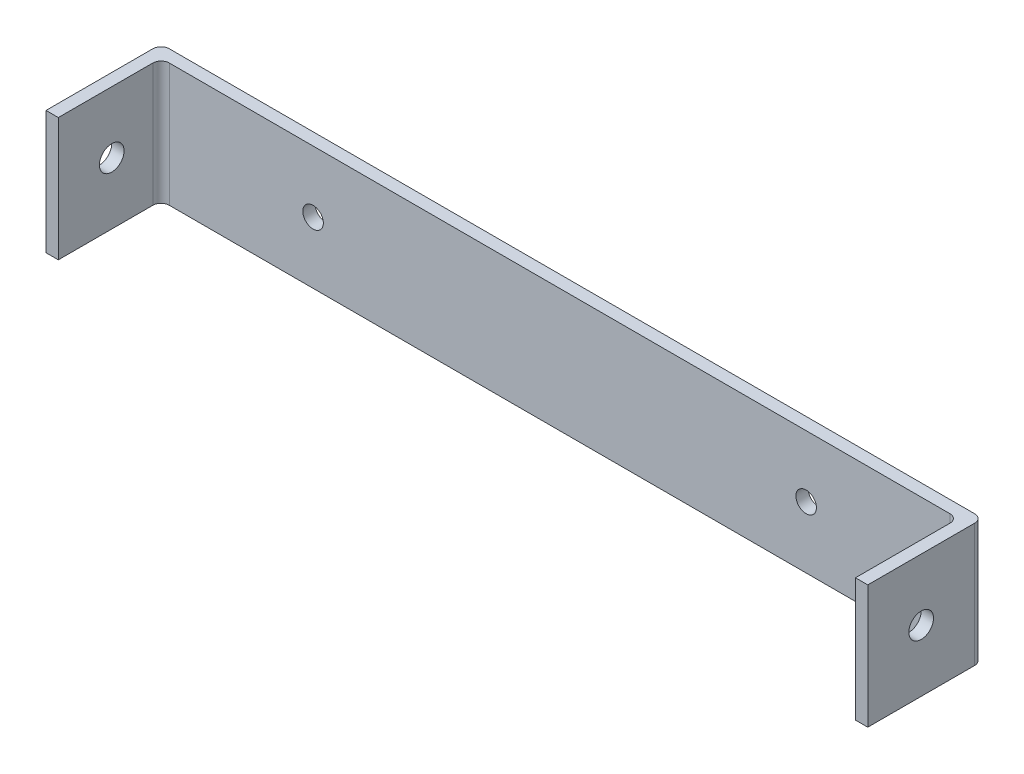
ISO-10303-21;
HEADER;
FILE_DESCRIPTION(('STEP AP214'),'2;1');
FILE_NAME('part.step','',(''),(''),'','','');
FILE_SCHEMA(('AUTOMOTIVE_DESIGN { 1 0 10303 214 1 1 1 1 }'));
ENDSEC;
DATA;
#1=APPLICATION_CONTEXT('core data for automotive mechanical design processes');
#2=APPLICATION_PROTOCOL_DEFINITION('international standard','automotive_design',2000,#1);
#3=PRODUCT_CONTEXT('',#1,'mechanical');
#4=PRODUCT('Part','Part','',(#3));
#5=PRODUCT_RELATED_PRODUCT_CATEGORY('part','',(#4));
#6=PRODUCT_DEFINITION_FORMATION('','',#4);
#7=PRODUCT_DEFINITION_CONTEXT('part definition',#1,'design');
#8=PRODUCT_DEFINITION('design','',#6,#7);
#9=PRODUCT_DEFINITION_SHAPE('','',#8);
#10=(LENGTH_UNIT() NAMED_UNIT(*) SI_UNIT(.MILLI.,.METRE.));
#11=(NAMED_UNIT(*) PLANE_ANGLE_UNIT() SI_UNIT($,.RADIAN.));
#12=(NAMED_UNIT(*) SI_UNIT($,.STERADIAN.) SOLID_ANGLE_UNIT());
#13=UNCERTAINTY_MEASURE_WITH_UNIT(LENGTH_MEASURE(1.E-05),#10,'distance_accuracy_value','');
#14=(GEOMETRIC_REPRESENTATION_CONTEXT(3) GLOBAL_UNCERTAINTY_ASSIGNED_CONTEXT((#13)) GLOBAL_UNIT_ASSIGNED_CONTEXT((#10,
#11,#12)) REPRESENTATION_CONTEXT('',''));
#15=CARTESIAN_POINT('',(0.,0.,0.));
#16=DIRECTION('',(0.,0.,1.));
#17=DIRECTION('',(1.,0.,0.));
#18=AXIS2_PLACEMENT_3D('',#15,#16,#17);
#19=CARTESIAN_POINT('',(0.,0.,3.));
#20=DIRECTION('',(0.,0.,1.));
#21=DIRECTION('',(1.,0.,0.));
#22=AXIS2_PLACEMENT_3D('',#19,#20,#21);
#23=PLANE('',#22);
#24=CARTESIAN_POINT('',(40.,-15.,3.));
#25=DIRECTION('',(0.,0.,1.));
#26=DIRECTION('',(1.,0.,0.));
#27=AXIS2_PLACEMENT_3D('',#24,#25,#26);
#28=CIRCLE('',#27,2.5);
#29=CARTESIAN_POINT('',(42.5,-15.,3.));
#30=VERTEX_POINT('',#29);
#31=EDGE_CURVE('E184',#30,#30,#28,.T.);
#32=ORIENTED_EDGE('',*,*,#31,.F.);
#33=EDGE_LOOP('',(#32));
#34=FACE_BOUND('',#33,.T.);
#35=CARTESIAN_POINT('',(160.,-15.,3.));
#36=DIRECTION('',(0.,0.,1.));
#37=DIRECTION('',(1.,0.,0.));
#38=AXIS2_PLACEMENT_3D('',#35,#36,#37);
#39=CIRCLE('',#38,2.5);
#40=CARTESIAN_POINT('',(162.5,-15.,3.));
#41=VERTEX_POINT('',#40);
#42=EDGE_CURVE('E178',#41,#41,#39,.T.);
#43=ORIENTED_EDGE('',*,*,#42,.F.);
#44=EDGE_LOOP('',(#43));
#45=FACE_BOUND('',#44,.T.);
#46=DIRECTION('',(1.,0.,0.));
#47=VECTOR('',#46,1.);
#48=CARTESIAN_POINT('',(0.,-30.,3.));
#49=LINE('',#48,#47);
#50=CARTESIAN_POINT('',(5.,-30.,3.));
#51=VERTEX_POINT('',#50);
#52=CARTESIAN_POINT('',(195.,-30.,3.));
#53=VERTEX_POINT('',#52);
#54=EDGE_CURVE('E190',#51,#53,#49,.T.);
#55=ORIENTED_EDGE('',*,*,#54,.T.);
#56=DIRECTION('',(0.,-1.,0.));
#57=VECTOR('',#56,1.);
#58=CARTESIAN_POINT('',(195.,0.,3.));
#59=LINE('',#58,#57);
#60=CARTESIAN_POINT('',(195.,0.,3.));
#61=VERTEX_POINT('',#60);
#62=EDGE_CURVE('E228',#53,#61,#59,.F.);
#63=ORIENTED_EDGE('',*,*,#62,.T.);
#64=DIRECTION('',(-1.,0.,0.));
#65=VECTOR('',#64,1.);
#66=CARTESIAN_POINT('',(0.,0.,3.));
#67=LINE('',#66,#65);
#68=CARTESIAN_POINT('',(5.,0.,3.));
#69=VERTEX_POINT('',#68);
#70=EDGE_CURVE('E193',#61,#69,#67,.T.);
#71=ORIENTED_EDGE('',*,*,#70,.T.);
#72=DIRECTION('',(0.,1.,0.));
#73=VECTOR('',#72,1.);
#74=CARTESIAN_POINT('',(5.,0.,3.));
#75=LINE('',#74,#73);
#76=EDGE_CURVE('E226',#69,#51,#75,.F.);
#77=ORIENTED_EDGE('',*,*,#76,.T.);
#78=EDGE_LOOP('',(#55,#63,#71,#77));
#79=FACE_BOUND('',#78,.T.);
#80=ADVANCED_FACE('F33',(#34,#45,#79),#23,.T.);
#81=CARTESIAN_POINT('',(0.,0.,0.));
#82=DIRECTION('',(0.,0.,1.));
#83=DIRECTION('',(1.,0.,0.));
#84=AXIS2_PLACEMENT_3D('',#81,#82,#83);
#85=PLANE('',#84);
#86=DIRECTION('',(-1.,0.,0.));
#87=VECTOR('',#86,1.);
#88=CARTESIAN_POINT('',(0.,0.,0.));
#89=LINE('',#88,#87);
#90=CARTESIAN_POINT('',(198.,0.,0.));
#91=VERTEX_POINT('',#90);
#92=CARTESIAN_POINT('',(2.,0.,0.));
#93=VERTEX_POINT('',#92);
#94=EDGE_CURVE('E194',#91,#93,#89,.T.);
#95=ORIENTED_EDGE('',*,*,#94,.F.);
#96=DIRECTION('',(0.,1.,0.));
#97=VECTOR('',#96,1.);
#98=CARTESIAN_POINT('',(198.,0.,0.));
#99=LINE('',#98,#97);
#100=CARTESIAN_POINT('',(198.,-30.,0.));
#101=VERTEX_POINT('',#100);
#102=EDGE_CURVE('E218',#91,#101,#99,.F.);
#103=ORIENTED_EDGE('',*,*,#102,.T.);
#104=DIRECTION('',(1.,0.,0.));
#105=VECTOR('',#104,1.);
#106=CARTESIAN_POINT('',(0.,-30.,0.));
#107=LINE('',#106,#105);
#108=CARTESIAN_POINT('',(2.,-30.,0.));
#109=VERTEX_POINT('',#108);
#110=EDGE_CURVE('E187',#109,#101,#107,.T.);
#111=ORIENTED_EDGE('',*,*,#110,.F.);
#112=DIRECTION('',(0.,-1.,0.));
#113=VECTOR('',#112,1.);
#114=CARTESIAN_POINT('',(2.,0.,0.));
#115=LINE('',#114,#113);
#116=EDGE_CURVE('E216',#109,#93,#115,.F.);
#117=ORIENTED_EDGE('',*,*,#116,.T.);
#118=EDGE_LOOP('',(#95,#103,#111,#117));
#119=FACE_BOUND('',#118,.T.);
#120=CARTESIAN_POINT('',(40.,-15.,0.));
#121=DIRECTION('',(0.,0.,1.));
#122=DIRECTION('',(1.,0.,0.));
#123=AXIS2_PLACEMENT_3D('',#120,#121,#122);
#124=CIRCLE('',#123,2.5);
#125=CARTESIAN_POINT('',(42.5,-15.,0.));
#126=VERTEX_POINT('',#125);
#127=EDGE_CURVE('E181',#126,#126,#124,.T.);
#128=ORIENTED_EDGE('',*,*,#127,.T.);
#129=EDGE_LOOP('',(#128));
#130=FACE_BOUND('',#129,.T.);
#131=CARTESIAN_POINT('',(160.,-15.,0.));
#132=DIRECTION('',(0.,0.,1.));
#133=DIRECTION('',(1.,0.,0.));
#134=AXIS2_PLACEMENT_3D('',#131,#132,#133);
#135=CIRCLE('',#134,2.5);
#136=CARTESIAN_POINT('',(162.5,-15.,0.));
#137=VERTEX_POINT('',#136);
#138=EDGE_CURVE('E177',#137,#137,#135,.T.);
#139=ORIENTED_EDGE('',*,*,#138,.T.);
#140=EDGE_LOOP('',(#139));
#141=FACE_BOUND('',#140,.T.);
#142=ADVANCED_FACE('F262',(#119,#130,#141),#85,.F.);
#143=CARTESIAN_POINT('',(0.,0.,3.));
#144=DIRECTION('',(1.,0.,0.));
#145=DIRECTION('',(0.,0.,-1.));
#146=AXIS2_PLACEMENT_3D('',#143,#144,#145);
#147=PLANE('',#146);
#148=CARTESIAN_POINT('',(0.,-15.,15.));
#149=DIRECTION('',(-1.,0.,0.));
#150=DIRECTION('',(0.,0.,1.));
#151=AXIS2_PLACEMENT_3D('',#148,#149,#150);
#152=CIRCLE('',#151,3.);
#153=CARTESIAN_POINT('',(0.,-15.,18.));
#154=VERTEX_POINT('',#153);
#155=EDGE_CURVE('E210',#154,#154,#152,.T.);
#156=ORIENTED_EDGE('',*,*,#155,.F.);
#157=EDGE_LOOP('',(#156));
#158=FACE_BOUND('',#157,.T.);
#159=DIRECTION('',(0.,0.,-1.));
#160=VECTOR('',#159,1.);
#161=CARTESIAN_POINT('',(0.,0.,3.));
#162=LINE('',#161,#160);
#163=CARTESIAN_POINT('',(0.,0.,28.));
#164=VERTEX_POINT('',#163);
#165=CARTESIAN_POINT('',(0.,0.,2.));
#166=VERTEX_POINT('',#165);
#167=EDGE_CURVE('E134',#164,#166,#162,.T.);
#168=ORIENTED_EDGE('',*,*,#167,.T.);
#169=DIRECTION('',(0.,-1.,0.));
#170=VECTOR('',#169,1.);
#171=CARTESIAN_POINT('',(0.,0.,2.));
#172=LINE('',#171,#170);
#173=CARTESIAN_POINT('',(0.,-30.,2.));
#174=VERTEX_POINT('',#173);
#175=EDGE_CURVE('E230',#166,#174,#172,.T.);
#176=ORIENTED_EDGE('',*,*,#175,.T.);
#177=DIRECTION('',(0.,0.,-1.));
#178=VECTOR('',#177,1.);
#179=CARTESIAN_POINT('',(0.,-30.,3.));
#180=LINE('',#179,#178);
#181=CARTESIAN_POINT('',(0.,-30.,28.));
#182=VERTEX_POINT('',#181);
#183=EDGE_CURVE('E204',#182,#174,#180,.T.);
#184=ORIENTED_EDGE('',*,*,#183,.F.);
#185=DIRECTION('',(0.,-1.,0.));
#186=VECTOR('',#185,1.);
#187=CARTESIAN_POINT('',(0.,-30.,28.));
#188=LINE('',#187,#186);
#189=EDGE_CURVE('E162',#164,#182,#188,.T.);
#190=ORIENTED_EDGE('',*,*,#189,.F.);
#191=EDGE_LOOP('',(#168,#176,#184,#190));
#192=FACE_BOUND('',#191,.T.);
#193=ADVANCED_FACE('F256',(#158,#192),#147,.F.);
#194=CARTESIAN_POINT('',(0.,-30.,3.));
#195=DIRECTION('',(0.,1.,0.));
#196=DIRECTION('',(0.,0.,1.));
#197=AXIS2_PLACEMENT_3D('',#194,#195,#196);
#198=PLANE('',#197);
#199=ORIENTED_EDGE('',*,*,#110,.T.);
#200=CARTESIAN_POINT('',(198.,-30.,2.));
#201=DIRECTION('',(0.,1.,0.));
#202=DIRECTION('',(0.,0.,1.));
#203=AXIS2_PLACEMENT_3D('',#200,#201,#202);
#204=CIRCLE('',#203,2.);
#205=CARTESIAN_POINT('',(200.,-30.,2.));
#206=VERTEX_POINT('',#205);
#207=EDGE_CURVE('E221',#101,#206,#204,.F.);
#208=ORIENTED_EDGE('',*,*,#207,.T.);
#209=DIRECTION('',(0.,0.,-1.));
#210=VECTOR('',#209,1.);
#211=CARTESIAN_POINT('',(200.,-30.,3.));
#212=LINE('',#211,#210);
#213=CARTESIAN_POINT('',(200.,-30.,28.));
#214=VERTEX_POINT('',#213);
#215=EDGE_CURVE('E133',#214,#206,#212,.T.);
#216=ORIENTED_EDGE('',*,*,#215,.F.);
#217=DIRECTION('',(1.,0.,0.));
#218=VECTOR('',#217,1.);
#219=CARTESIAN_POINT('',(200.,-30.,28.));
#220=LINE('',#219,#218);
#221=CARTESIAN_POINT('',(197.,-30.,28.));
#222=VERTEX_POINT('',#221);
#223=EDGE_CURVE('E148',#222,#214,#220,.T.);
#224=ORIENTED_EDGE('',*,*,#223,.F.);
#225=DIRECTION('',(0.,0.,-1.));
#226=VECTOR('',#225,1.);
#227=CARTESIAN_POINT('',(197.,-30.,28.));
#228=LINE('',#227,#226);
#229=CARTESIAN_POINT('',(197.,-30.,5.));
#230=VERTEX_POINT('',#229);
#231=EDGE_CURVE('E158',#222,#230,#228,.T.);
#232=ORIENTED_EDGE('',*,*,#231,.T.);
#233=CARTESIAN_POINT('',(195.,-30.,5.));
#234=DIRECTION('',(0.,1.,0.));
#235=DIRECTION('',(0.,0.,1.));
#236=AXIS2_PLACEMENT_3D('',#233,#234,#235);
#237=CIRCLE('',#236,2.);
#238=EDGE_CURVE('E235',#230,#53,#237,.T.);
#239=ORIENTED_EDGE('',*,*,#238,.T.);
#240=ORIENTED_EDGE('',*,*,#54,.F.);
#241=CARTESIAN_POINT('',(5.,-30.,5.));
#242=DIRECTION('',(0.,1.,0.));
#243=DIRECTION('',(0.,0.,1.));
#244=AXIS2_PLACEMENT_3D('',#241,#242,#243);
#245=CIRCLE('',#244,2.);
#246=CARTESIAN_POINT('',(3.,-30.,5.));
#247=VERTEX_POINT('',#246);
#248=EDGE_CURVE('E11',#51,#247,#245,.T.);
#249=ORIENTED_EDGE('',*,*,#248,.T.);
#250=DIRECTION('',(0.,0.,-1.));
#251=VECTOR('',#250,1.);
#252=CARTESIAN_POINT('',(3.,-30.,28.));
#253=LINE('',#252,#251);
#254=CARTESIAN_POINT('',(3.,-30.,28.));
#255=VERTEX_POINT('',#254);
#256=EDGE_CURVE('E175',#255,#247,#253,.T.);
#257=ORIENTED_EDGE('',*,*,#256,.F.);
#258=DIRECTION('',(1.,0.,0.));
#259=VECTOR('',#258,1.);
#260=CARTESIAN_POINT('',(0.,-30.,28.));
#261=LINE('',#260,#259);
#262=EDGE_CURVE('E165',#182,#255,#261,.T.);
#263=ORIENTED_EDGE('',*,*,#262,.F.);
#264=ORIENTED_EDGE('',*,*,#183,.T.);
#265=CARTESIAN_POINT('',(2.,-30.,2.));
#266=DIRECTION('',(0.,1.,0.));
#267=DIRECTION('',(0.,0.,1.));
#268=AXIS2_PLACEMENT_3D('',#265,#266,#267);
#269=CIRCLE('',#268,2.);
#270=EDGE_CURVE('E48',#174,#109,#269,.F.);
#271=ORIENTED_EDGE('',*,*,#270,.T.);
#272=EDGE_LOOP('',(#199,#208,#216,#224,#232,#239,#240,#249,#257,#263,#264,#271));
#273=FACE_BOUND('',#272,.T.);
#274=ADVANCED_FACE('F251',(#273),#198,.F.);
#275=CARTESIAN_POINT('',(200.,0.,3.));
#276=DIRECTION('',(-1.,0.,0.));
#277=DIRECTION('',(0.,0.,1.));
#278=AXIS2_PLACEMENT_3D('',#275,#276,#277);
#279=PLANE('',#278);
#280=CARTESIAN_POINT('',(200.,-15.,15.));
#281=DIRECTION('',(-1.,0.,0.));
#282=DIRECTION('',(0.,0.,1.));
#283=AXIS2_PLACEMENT_3D('',#280,#281,#282);
#284=CIRCLE('',#283,3.);
#285=CARTESIAN_POINT('',(200.,-15.,18.));
#286=VERTEX_POINT('',#285);
#287=EDGE_CURVE('E149',#286,#286,#284,.T.);
#288=ORIENTED_EDGE('',*,*,#287,.T.);
#289=EDGE_LOOP('',(#288));
#290=FACE_BOUND('',#289,.T.);
#291=ORIENTED_EDGE('',*,*,#215,.T.);
#292=DIRECTION('',(0.,1.,0.));
#293=VECTOR('',#292,1.);
#294=CARTESIAN_POINT('',(200.,0.,2.));
#295=LINE('',#294,#293);
#296=CARTESIAN_POINT('',(200.,0.,2.));
#297=VERTEX_POINT('',#296);
#298=EDGE_CURVE('E131',#206,#297,#295,.T.);
#299=ORIENTED_EDGE('',*,*,#298,.T.);
#300=DIRECTION('',(0.,0.,-1.));
#301=VECTOR('',#300,1.);
#302=CARTESIAN_POINT('',(200.,0.,3.));
#303=LINE('',#302,#301);
#304=CARTESIAN_POINT('',(200.,0.,28.));
#305=VERTEX_POINT('',#304);
#306=EDGE_CURVE('E124',#305,#297,#303,.T.);
#307=ORIENTED_EDGE('',*,*,#306,.F.);
#308=DIRECTION('',(0.,1.,0.));
#309=VECTOR('',#308,1.);
#310=CARTESIAN_POINT('',(200.,0.,28.));
#311=LINE('',#310,#309);
#312=EDGE_CURVE('E129',#214,#305,#311,.T.);
#313=ORIENTED_EDGE('',*,*,#312,.F.);
#314=EDGE_LOOP('',(#291,#299,#307,#313));
#315=FACE_BOUND('',#314,.T.);
#316=ADVANCED_FACE('F127',(#290,#315),#279,.F.);
#317=CARTESIAN_POINT('',(0.,0.,3.));
#318=DIRECTION('',(0.,-1.,0.));
#319=DIRECTION('',(0.,0.,-1.));
#320=AXIS2_PLACEMENT_3D('',#317,#318,#319);
#321=PLANE('',#320);
#322=ORIENTED_EDGE('',*,*,#306,.T.);
#323=CARTESIAN_POINT('',(198.,0.,2.));
#324=DIRECTION('',(0.,-1.,0.));
#325=DIRECTION('',(0.,0.,-1.));
#326=AXIS2_PLACEMENT_3D('',#323,#324,#325);
#327=CIRCLE('',#326,2.);
#328=EDGE_CURVE('E214',#297,#91,#327,.F.);
#329=ORIENTED_EDGE('',*,*,#328,.T.);
#330=ORIENTED_EDGE('',*,*,#94,.T.);
#331=CARTESIAN_POINT('',(2.,0.,2.));
#332=DIRECTION('',(0.,-1.,0.));
#333=DIRECTION('',(0.,0.,-1.));
#334=AXIS2_PLACEMENT_3D('',#331,#332,#333);
#335=CIRCLE('',#334,2.);
#336=EDGE_CURVE('E212',#93,#166,#335,.F.);
#337=ORIENTED_EDGE('',*,*,#336,.T.);
#338=ORIENTED_EDGE('',*,*,#167,.F.);
#339=DIRECTION('',(-1.,0.,0.));
#340=VECTOR('',#339,1.);
#341=CARTESIAN_POINT('',(0.,0.,28.));
#342=LINE('',#341,#340);
#343=CARTESIAN_POINT('',(3.,0.,28.));
#344=VERTEX_POINT('',#343);
#345=EDGE_CURVE('E169',#344,#164,#342,.T.);
#346=ORIENTED_EDGE('',*,*,#345,.F.);
#347=DIRECTION('',(0.,0.,-1.));
#348=VECTOR('',#347,1.);
#349=CARTESIAN_POINT('',(3.,0.,28.));
#350=LINE('',#349,#348);
#351=CARTESIAN_POINT('',(3.,0.,5.));
#352=VERTEX_POINT('',#351);
#353=EDGE_CURVE('E172',#344,#352,#350,.T.);
#354=ORIENTED_EDGE('',*,*,#353,.T.);
#355=CARTESIAN_POINT('',(5.,0.,5.));
#356=DIRECTION('',(0.,-1.,0.));
#357=DIRECTION('',(0.,0.,-1.));
#358=AXIS2_PLACEMENT_3D('',#355,#356,#357);
#359=CIRCLE('',#358,2.);
#360=EDGE_CURVE('E41',#352,#69,#359,.T.);
#361=ORIENTED_EDGE('',*,*,#360,.T.);
#362=ORIENTED_EDGE('',*,*,#70,.F.);
#363=CARTESIAN_POINT('',(195.,0.,5.));
#364=DIRECTION('',(0.,-1.,0.));
#365=DIRECTION('',(0.,0.,-1.));
#366=AXIS2_PLACEMENT_3D('',#363,#364,#365);
#367=CIRCLE('',#366,2.);
#368=CARTESIAN_POINT('',(197.,0.,5.));
#369=VERTEX_POINT('',#368);
#370=EDGE_CURVE('E237',#61,#369,#367,.T.);
#371=ORIENTED_EDGE('',*,*,#370,.T.);
#372=DIRECTION('',(0.,0.,-1.));
#373=VECTOR('',#372,1.);
#374=CARTESIAN_POINT('',(197.,0.,28.));
#375=LINE('',#374,#373);
#376=CARTESIAN_POINT('',(197.,0.,28.));
#377=VERTEX_POINT('',#376);
#378=EDGE_CURVE('E140',#377,#369,#375,.T.);
#379=ORIENTED_EDGE('',*,*,#378,.F.);
#380=DIRECTION('',(-1.,0.,0.));
#381=VECTOR('',#380,1.);
#382=CARTESIAN_POINT('',(200.,0.,28.));
#383=LINE('',#382,#381);
#384=EDGE_CURVE('E137',#305,#377,#383,.T.);
#385=ORIENTED_EDGE('',*,*,#384,.F.);
#386=EDGE_LOOP('',(#322,#329,#330,#337,#338,#346,#354,#361,#362,#371,#379,#385));
#387=FACE_BOUND('',#386,.T.);
#388=ADVANCED_FACE('F138',(#387),#321,.F.);
#389=CARTESIAN_POINT('',(40.,-15.,3.));
#390=DIRECTION('',(0.,0.,-1.));
#391=DIRECTION('',(-1.,0.,0.));
#392=AXIS2_PLACEMENT_3D('',#389,#390,#391);
#393=CYLINDRICAL_SURFACE('',#392,2.5);
#394=ORIENTED_EDGE('',*,*,#31,.T.);
#395=EDGE_LOOP('',(#394));
#396=FACE_BOUND('',#395,.T.);
#397=ORIENTED_EDGE('',*,*,#127,.F.);
#398=EDGE_LOOP('',(#397));
#399=FACE_BOUND('',#398,.T.);
#400=ADVANCED_FACE('F292',(#396,#399),#393,.F.);
#401=CARTESIAN_POINT('',(160.,-15.,3.));
#402=DIRECTION('',(0.,0.,-1.));
#403=DIRECTION('',(-1.,0.,0.));
#404=AXIS2_PLACEMENT_3D('',#401,#402,#403);
#405=CYLINDRICAL_SURFACE('',#404,2.5);
#406=ORIENTED_EDGE('',*,*,#42,.T.);
#407=EDGE_LOOP('',(#406));
#408=FACE_BOUND('',#407,.T.);
#409=ORIENTED_EDGE('',*,*,#138,.F.);
#410=EDGE_LOOP('',(#409));
#411=FACE_BOUND('',#410,.T.);
#412=ADVANCED_FACE('F330',(#408,#411),#405,.F.);
#413=CARTESIAN_POINT('',(3.,-30.,28.));
#414=DIRECTION('',(-1.,0.,0.));
#415=DIRECTION('',(0.,-1.,0.));
#416=AXIS2_PLACEMENT_3D('',#413,#414,#415);
#417=PLANE('',#416);
#418=CARTESIAN_POINT('',(3.,-15.,15.));
#419=DIRECTION('',(-1.,0.,0.));
#420=DIRECTION('',(0.,-1.,0.));
#421=AXIS2_PLACEMENT_3D('',#418,#419,#420);
#422=CIRCLE('',#421,3.);
#423=CARTESIAN_POINT('',(3.,-18.,15.));
#424=VERTEX_POINT('',#423);
#425=EDGE_CURVE('E152',#424,#424,#422,.T.);
#426=ORIENTED_EDGE('',*,*,#425,.T.);
#427=EDGE_LOOP('',(#426));
#428=FACE_BOUND('',#427,.T.);
#429=ORIENTED_EDGE('',*,*,#256,.T.);
#430=DIRECTION('',(0.,1.,0.));
#431=VECTOR('',#430,1.);
#432=CARTESIAN_POINT('',(3.,-30.,5.));
#433=LINE('',#432,#431);
#434=EDGE_CURVE('E232',#247,#352,#433,.T.);
#435=ORIENTED_EDGE('',*,*,#434,.T.);
#436=ORIENTED_EDGE('',*,*,#353,.F.);
#437=DIRECTION('',(0.,1.,0.));
#438=VECTOR('',#437,1.);
#439=CARTESIAN_POINT('',(3.,-30.,28.));
#440=LINE('',#439,#438);
#441=EDGE_CURVE('E167',#255,#344,#440,.T.);
#442=ORIENTED_EDGE('',*,*,#441,.F.);
#443=EDGE_LOOP('',(#429,#435,#436,#442));
#444=FACE_BOUND('',#443,.T.);
#445=ADVANCED_FACE('F248',(#428,#444),#417,.F.);
#446=CARTESIAN_POINT('',(0.,0.,28.));
#447=DIRECTION('',(0.,0.,-1.));
#448=DIRECTION('',(-1.,0.,0.));
#449=AXIS2_PLACEMENT_3D('',#446,#447,#448);
#450=PLANE('',#449);
#451=ORIENTED_EDGE('',*,*,#189,.T.);
#452=ORIENTED_EDGE('',*,*,#262,.T.);
#453=ORIENTED_EDGE('',*,*,#441,.T.);
#454=ORIENTED_EDGE('',*,*,#345,.T.);
#455=EDGE_LOOP('',(#451,#452,#453,#454));
#456=FACE_BOUND('',#455,.T.);
#457=ADVANCED_FACE('F254',(#456),#450,.F.);
#458=CARTESIAN_POINT('',(197.,0.,28.));
#459=DIRECTION('',(1.,0.,0.));
#460=DIRECTION('',(0.,0.,-1.));
#461=AXIS2_PLACEMENT_3D('',#458,#459,#460);
#462=PLANE('',#461);
#463=CARTESIAN_POINT('',(197.,-15.,15.));
#464=DIRECTION('',(1.,0.,0.));
#465=DIRECTION('',(0.,0.,-1.));
#466=AXIS2_PLACEMENT_3D('',#463,#464,#465);
#467=CIRCLE('',#466,3.);
#468=CARTESIAN_POINT('',(197.,-15.,12.));
#469=VERTEX_POINT('',#468);
#470=EDGE_CURVE('E207',#469,#469,#467,.T.);
#471=ORIENTED_EDGE('',*,*,#470,.T.);
#472=EDGE_LOOP('',(#471));
#473=FACE_BOUND('',#472,.T.);
#474=ORIENTED_EDGE('',*,*,#378,.T.);
#475=DIRECTION('',(0.,-1.,0.));
#476=VECTOR('',#475,1.);
#477=CARTESIAN_POINT('',(197.,0.,5.));
#478=LINE('',#477,#476);
#479=EDGE_CURVE('E223',#369,#230,#478,.T.);
#480=ORIENTED_EDGE('',*,*,#479,.T.);
#481=ORIENTED_EDGE('',*,*,#231,.F.);
#482=DIRECTION('',(0.,-1.,0.));
#483=VECTOR('',#482,1.);
#484=CARTESIAN_POINT('',(197.,0.,28.));
#485=LINE('',#484,#483);
#486=EDGE_CURVE('E143',#377,#222,#485,.T.);
#487=ORIENTED_EDGE('',*,*,#486,.F.);
#488=EDGE_LOOP('',(#474,#480,#481,#487));
#489=FACE_BOUND('',#488,.T.);
#490=ADVANCED_FACE('F270',(#473,#489),#462,.F.);
#491=CARTESIAN_POINT('',(0.,0.,28.));
#492=DIRECTION('',(0.,0.,-1.));
#493=DIRECTION('',(-1.,0.,0.));
#494=AXIS2_PLACEMENT_3D('',#491,#492,#493);
#495=PLANE('',#494);
#496=ORIENTED_EDGE('',*,*,#312,.T.);
#497=ORIENTED_EDGE('',*,*,#384,.T.);
#498=ORIENTED_EDGE('',*,*,#486,.T.);
#499=ORIENTED_EDGE('',*,*,#223,.T.);
#500=EDGE_LOOP('',(#496,#497,#498,#499));
#501=FACE_BOUND('',#500,.T.);
#502=ADVANCED_FACE('F146',(#501),#495,.F.);
#503=CARTESIAN_POINT('',(229.,-15.,15.));
#504=DIRECTION('',(-1.,0.,0.));
#505=DIRECTION('',(0.,0.,1.));
#506=AXIS2_PLACEMENT_3D('',#503,#504,#505);
#507=CYLINDRICAL_SURFACE('',#506,3.);
#508=ORIENTED_EDGE('',*,*,#470,.F.);
#509=EDGE_LOOP('',(#508));
#510=FACE_BOUND('',#509,.T.);
#511=ORIENTED_EDGE('',*,*,#287,.F.);
#512=EDGE_LOOP('',(#511));
#513=FACE_BOUND('',#512,.T.);
#514=ADVANCED_FACE('F315',(#510,#513),#507,.F.);
#515=ORIENTED_EDGE('',*,*,#155,.T.);
#516=EDGE_LOOP('',(#515));
#517=FACE_BOUND('',#516,.T.);
#518=ORIENTED_EDGE('',*,*,#425,.F.);
#519=EDGE_LOOP('',(#518));
#520=FACE_BOUND('',#519,.T.);
#521=ADVANCED_FACE('F280',(#517,#520),#507,.F.);
#522=CARTESIAN_POINT('',(198.,0.,2.));
#523=DIRECTION('',(0.,1.,0.));
#524=DIRECTION('',(0.,0.,1.));
#525=AXIS2_PLACEMENT_3D('',#522,#523,#524);
#526=CYLINDRICAL_SURFACE('',#525,2.);
#527=ORIENTED_EDGE('',*,*,#207,.F.);
#528=ORIENTED_EDGE('',*,*,#102,.F.);
#529=ORIENTED_EDGE('',*,*,#328,.F.);
#530=ORIENTED_EDGE('',*,*,#298,.F.);
#531=EDGE_LOOP('',(#527,#528,#529,#530));
#532=FACE_BOUND('',#531,.T.);
#533=ADVANCED_FACE('F267',(#532),#526,.T.);
#534=CARTESIAN_POINT('',(195.,0.,5.));
#535=DIRECTION('',(0.,-1.,0.));
#536=DIRECTION('',(0.,0.,-1.));
#537=AXIS2_PLACEMENT_3D('',#534,#535,#536);
#538=CYLINDRICAL_SURFACE('',#537,2.);
#539=ORIENTED_EDGE('',*,*,#370,.F.);
#540=ORIENTED_EDGE('',*,*,#62,.F.);
#541=ORIENTED_EDGE('',*,*,#238,.F.);
#542=ORIENTED_EDGE('',*,*,#479,.F.);
#543=EDGE_LOOP('',(#539,#540,#541,#542));
#544=FACE_BOUND('',#543,.T.);
#545=ADVANCED_FACE('F273',(#544),#538,.F.);
#546=CARTESIAN_POINT('',(2.,0.,2.));
#547=DIRECTION('',(0.,-1.,0.));
#548=DIRECTION('',(0.,0.,-1.));
#549=AXIS2_PLACEMENT_3D('',#546,#547,#548);
#550=CYLINDRICAL_SURFACE('',#549,2.);
#551=ORIENTED_EDGE('',*,*,#336,.F.);
#552=ORIENTED_EDGE('',*,*,#116,.F.);
#553=ORIENTED_EDGE('',*,*,#270,.F.);
#554=ORIENTED_EDGE('',*,*,#175,.F.);
#555=EDGE_LOOP('',(#551,#552,#553,#554));
#556=FACE_BOUND('',#555,.T.);
#557=ADVANCED_FACE('F258',(#556),#550,.T.);
#558=CARTESIAN_POINT('',(5.,-30.,5.));
#559=DIRECTION('',(0.,1.,0.));
#560=DIRECTION('',(-1.,0.,0.));
#561=AXIS2_PLACEMENT_3D('',#558,#559,#560);
#562=CYLINDRICAL_SURFACE('',#561,2.);
#563=ORIENTED_EDGE('',*,*,#248,.F.);
#564=ORIENTED_EDGE('',*,*,#76,.F.);
#565=ORIENTED_EDGE('',*,*,#360,.F.);
#566=ORIENTED_EDGE('',*,*,#434,.F.);
#567=EDGE_LOOP('',(#563,#564,#565,#566));
#568=FACE_BOUND('',#567,.T.);
#569=ADVANCED_FACE('F35',(#568),#562,.F.);
#570=CLOSED_SHELL('',(#80,#142,#193,#274,#316,#388,#400,#412,#445,#457,#490,#502,#514,#521,#533,
#545,#557,#569));
#571=MANIFOLD_SOLID_BREP('B2',#570);
#572=ADVANCED_BREP_SHAPE_REPRESENTATION('',(#18,#571),#14);
#573=SHAPE_DEFINITION_REPRESENTATION(#9,#572);
ENDSEC;
END-ISO-10303-21;
